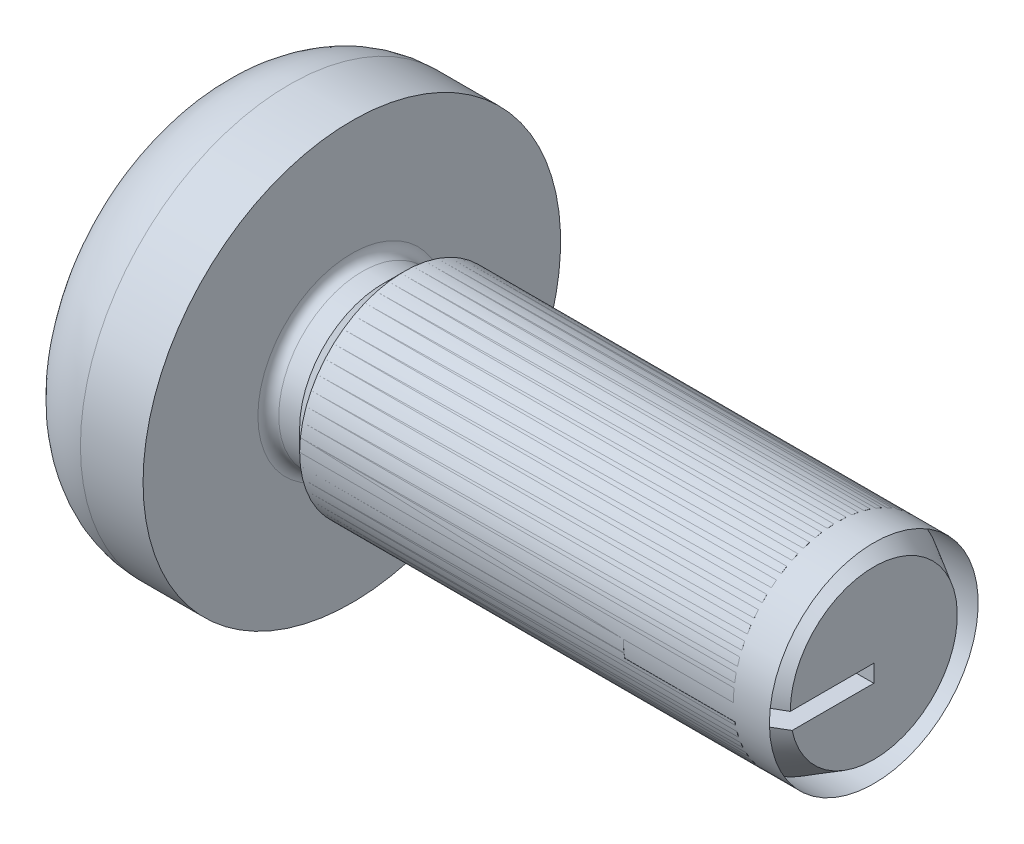
ISO-10303-21;
HEADER;
FILE_DESCRIPTION(('STEP AP214'),'2;1');
FILE_NAME('part.step','',(''),(''),'','','');
FILE_SCHEMA(('AUTOMOTIVE_DESIGN { 1 0 10303 214 1 1 1 1 }'));
ENDSEC;
DATA;
#1=APPLICATION_CONTEXT('core data for automotive mechanical design processes');
#2=APPLICATION_PROTOCOL_DEFINITION('international standard','automotive_design',2000,#1);
#3=PRODUCT_CONTEXT('',#1,'mechanical');
#4=PRODUCT('Part','Part','',(#3));
#5=PRODUCT_RELATED_PRODUCT_CATEGORY('part','',(#4));
#6=PRODUCT_DEFINITION_FORMATION('','',#4);
#7=PRODUCT_DEFINITION_CONTEXT('part definition',#1,'design');
#8=PRODUCT_DEFINITION('design','',#6,#7);
#9=PRODUCT_DEFINITION_SHAPE('','',#8);
#10=(LENGTH_UNIT() NAMED_UNIT(*) SI_UNIT(.MILLI.,.METRE.));
#11=(NAMED_UNIT(*) PLANE_ANGLE_UNIT() SI_UNIT($,.RADIAN.));
#12=(NAMED_UNIT(*) SI_UNIT($,.STERADIAN.) SOLID_ANGLE_UNIT());
#13=UNCERTAINTY_MEASURE_WITH_UNIT(LENGTH_MEASURE(1.E-05),#10,'distance_accuracy_value','');
#14=(GEOMETRIC_REPRESENTATION_CONTEXT(3) GLOBAL_UNCERTAINTY_ASSIGNED_CONTEXT((#13)) GLOBAL_UNIT_ASSIGNED_CONTEXT((#10,
#11,#12)) REPRESENTATION_CONTEXT('',''));
#15=CARTESIAN_POINT('',(0.,0.,0.));
#16=DIRECTION('',(0.,0.,1.));
#17=DIRECTION('',(1.,0.,0.));
#18=AXIS2_PLACEMENT_3D('',#15,#16,#17);
#19=CARTESIAN_POINT('',(0.380263667810502,0.,0.));
#20=DIRECTION('',(-1.,0.,0.));
#21=DIRECTION('',(0.,0.,1.));
#22=AXIS2_PLACEMENT_3D('',#19,#20,#21);
#23=CYLINDRICAL_SURFACE('',#22,0.625);
#24=CARTESIAN_POINT('',(1.5677636678105,0.,0.));
#25=DIRECTION('',(-1.,0.,0.));
#26=DIRECTION('',(0.,0.,1.));
#27=AXIS2_PLACEMENT_3D('',#24,#25,#26);
#28=CIRCLE('',#27,0.625);
#29=CARTESIAN_POINT('',(1.5677636678105,0.,0.625));
#30=VERTEX_POINT('',#29);
#31=EDGE_CURVE('E208',#30,#30,#28,.T.);
#32=ORIENTED_EDGE('',*,*,#31,.F.);
#33=EDGE_LOOP('',(#32));
#34=FACE_BOUND('',#33,.T.);
#35=DIRECTION('',(-1.,0.,0.));
#36=VECTOR('',#35,1.);
#37=CARTESIAN_POINT('',(0.380263667810502,0.,0.625));
#38=LINE('',#37,#36);
#39=CARTESIAN_POINT('',(4.16375731686439,0.,0.625));
#40=VERTEX_POINT('',#39);
#41=CARTESIAN_POINT('',(3.5052636678105,0.,0.625));
#42=VERTEX_POINT('',#41);
#43=EDGE_CURVE('E350',#40,#42,#38,.T.);
#44=ORIENTED_EDGE('',*,*,#43,.F.);
#45=CARTESIAN_POINT('',(4.16375731686439,0.,0.));
#46=DIRECTION('',(-1.,0.,0.));
#47=DIRECTION('',(0.,0.,1.));
#48=AXIS2_PLACEMENT_3D('',#45,#46,#47);
#49=CIRCLE('',#48,0.625);
#50=CARTESIAN_POINT('',(4.16375731686439,-0.104166666666667,0.616258310739543));
#51=VERTEX_POINT('',#50);
#52=EDGE_CURVE('E347',#40,#51,#49,.T.);
#53=ORIENTED_EDGE('',*,*,#52,.T.);
#54=DIRECTION('',(-1.,0.,0.));
#55=VECTOR('',#54,1.);
#56=CARTESIAN_POINT('',(0.380263667810502,-0.104166666666667,0.616258310739544));
#57=LINE('',#56,#55);
#58=CARTESIAN_POINT('',(3.5052636678105,-0.104166666666667,0.616258310739544));
#59=VERTEX_POINT('',#58);
#60=EDGE_CURVE('E354',#59,#51,#57,.F.);
#61=ORIENTED_EDGE('',*,*,#60,.F.);
#62=CARTESIAN_POINT('',(3.5052636678105,0.,0.));
#63=DIRECTION('',(1.,0.,0.));
#64=DIRECTION('',(0.,0.,-1.));
#65=AXIS2_PLACEMENT_3D('',#62,#63,#64);
#66=CIRCLE('',#65,0.625);
#67=EDGE_CURVE('E12',#42,#59,#66,.T.);
#68=ORIENTED_EDGE('',*,*,#67,.F.);
#69=EDGE_LOOP('',(#44,#53,#61,#68));
#70=FACE_BOUND('',#69,.T.);
#71=ADVANCED_FACE('F44',(#34,#70),#23,.T.);
#72=CARTESIAN_POINT('',(4.16375731686439,0.,0.));
#73=DIRECTION('',(-1.,0.,0.));
#74=DIRECTION('',(0.,0.,1.));
#75=AXIS2_PLACEMENT_3D('',#72,#73,#74);
#76=CONICAL_SURFACE('',#75,0.625,0.523598775598293);
#77=ORIENTED_EDGE('',*,*,#52,.F.);
#78=DIRECTION('',(-0.866025403784441,0.,0.499999999999995));
#79=VECTOR('',#78,1.);
#80=CARTESIAN_POINT('',(5.24628907159495,0.,0.));
#81=LINE('',#80,#79);
#82=CARTESIAN_POINT('',(4.3802636678105,0.,0.5));
#83=VERTEX_POINT('',#82);
#84=EDGE_CURVE('E352',#40,#83,#81,.F.);
#85=ORIENTED_EDGE('',*,*,#84,.T.);
#86=CARTESIAN_POINT('',(4.3802636678105,0.,0.));
#87=DIRECTION('',(-1.,0.,0.));
#88=DIRECTION('',(0.,0.,1.));
#89=AXIS2_PLACEMENT_3D('',#86,#87,#88);
#90=CIRCLE('',#89,0.5);
#91=CARTESIAN_POINT('',(4.3802636678105,-0.104166666666667,0.489028941429396));
#92=VERTEX_POINT('',#91);
#93=EDGE_CURVE('E206',#83,#92,#90,.T.);
#94=ORIENTED_EDGE('',*,*,#93,.T.);
#95=CARTESIAN_POINT('',(4.9132359449589,-0.104166666666667,0.161629516517161));
#96=CARTESIAN_POINT('',(4.8955934769391,-0.104166666666667,0.173717735895785));
#97=CARTESIAN_POINT('',(4.87779788339217,-0.104166666666667,0.185576255125332));
#98=CARTESIAN_POINT('',(4.84199518748673,-0.104166666666667,0.208965011190701));
#99=CARTESIAN_POINT('',(4.82398811474114,-0.104166666666667,0.220495293232509));
#100=CARTESIAN_POINT('',(4.78785616303248,-0.104166666666667,0.24335950070111));
#101=CARTESIAN_POINT('',(4.76973131030053,-0.104166666666667,0.254693467918929));
#102=CARTESIAN_POINT('',(4.7333949664228,-0.104166666666667,0.277223400047055));
#103=CARTESIAN_POINT('',(4.71518347165011,-0.104166666666667,0.288419359108538));
#104=CARTESIAN_POINT('',(4.62703840514019,-0.104166666666667,0.342310237974458));
#105=CARTESIAN_POINT('',(4.55673005215801,-0.104166666666667,0.384390129499706));
#106=CARTESIAN_POINT('',(4.41583241356038,-0.104166666666667,0.46810411531456));
#107=CARTESIAN_POINT('',(4.34524307391098,-0.104166666666667,0.509738117553018));
#108=CARTESIAN_POINT('',(4.16707897189953,-0.104166666666667,0.614430801207478));
#109=CARTESIAN_POINT('',(4.05941539750572,-0.104166666666667,0.677338705090462));
#110=CARTESIAN_POINT('',(3.89785023528845,-0.104166666666667,0.771531672563001));
#111=CARTESIAN_POINT('',(3.8439940442539,-0.104166666666667,0.802895088044861));
#112=CARTESIAN_POINT('',(3.73625786465345,-0.104166666666667,0.865580839421581));
#113=CARTESIAN_POINT('',(3.68237787612275,-0.104166666666667,0.896903175376936));
#114=CARTESIAN_POINT('',(3.6284891272247,-0.104166666666667,0.928210568185007));
#115=B_SPLINE_CURVE_WITH_KNOTS('',3,(#95,#96,#97,#98,#99,#100,#101,#102,#103,#104,#105,#106,
#107,#108,#109,#110,#111,#112,#113,#114),.UNSPECIFIED.,.F.,.F.,(4,2,2,2,2,2,2,2,2,4),(0.,
0.0641527212972383,0.128296564085274,0.192426579972942,0.256559304428454,0.502368107267188,
0.748226713829344,1.12231031468587,1.3092792966044,1.49624800287637),.UNSPECIFIED.);
#116=EDGE_CURVE('E356',#92,#51,#115,.T.);
#117=ORIENTED_EDGE('',*,*,#116,.T.);
#118=EDGE_LOOP('',(#77,#85,#94,#117));
#119=FACE_BOUND('',#118,.T.);
#120=ADVANCED_FACE('F365',(#119),#76,.T.);
#121=CARTESIAN_POINT('',(4.3802636678105,0.625,0.));
#122=DIRECTION('',(-1.,0.,0.));
#123=DIRECTION('',(0.,0.,1.));
#124=AXIS2_PLACEMENT_3D('',#121,#122,#123);
#125=PLANE('',#124);
#126=DIRECTION('',(0.,0.,1.));
#127=VECTOR('',#126,1.);
#128=CARTESIAN_POINT('',(4.3802636678105,0.,0.));
#129=LINE('',#128,#127);
#130=CARTESIAN_POINT('',(4.3802636678105,0.,0.));
#131=VERTEX_POINT('',#130);
#132=EDGE_CURVE('E52',#131,#83,#129,.T.);
#133=ORIENTED_EDGE('',*,*,#132,.F.);
#134=DIRECTION('',(0.,1.,0.));
#135=VECTOR('',#134,1.);
#136=CARTESIAN_POINT('',(4.3802636678105,0.,0.));
#137=LINE('',#136,#135);
#138=CARTESIAN_POINT('',(4.3802636678105,-0.104166666666667,0.));
#139=VERTEX_POINT('',#138);
#140=EDGE_CURVE('E196',#139,#131,#137,.T.);
#141=ORIENTED_EDGE('',*,*,#140,.F.);
#142=DIRECTION('',(0.,0.,-1.));
#143=VECTOR('',#142,1.);
#144=CARTESIAN_POINT('',(4.3802636678105,-0.104166666666667,0.));
#145=LINE('',#144,#143);
#146=EDGE_CURVE('E207',#92,#139,#145,.T.);
#147=ORIENTED_EDGE('',*,*,#146,.F.);
#148=ORIENTED_EDGE('',*,*,#93,.F.);
#149=EDGE_LOOP('',(#133,#141,#147,#148));
#150=FACE_BOUND('',#149,.T.);
#151=ADVANCED_FACE('F204',(#150),#125,.F.);
#152=CARTESIAN_POINT('',(0.380263667810502,0.,0.));
#153=DIRECTION('',(1.,0.,0.));
#154=DIRECTION('',(0.,0.,-1.));
#155=AXIS2_PLACEMENT_3D('',#152,#153,#154);
#156=PLANE('',#155);
#157=CARTESIAN_POINT('',(0.380263667810502,0.,0.));
#158=DIRECTION('',(-1.,0.,0.));
#159=DIRECTION('',(0.,0.,1.));
#160=AXIS2_PLACEMENT_3D('',#157,#158,#159);
#161=CIRCLE('',#160,0.75);
#162=CARTESIAN_POINT('',(0.380263667810502,0.,0.75));
#163=VERTEX_POINT('',#162);
#164=EDGE_CURVE('E234',#163,#163,#161,.T.);
#165=ORIENTED_EDGE('',*,*,#164,.T.);
#166=EDGE_LOOP('',(#165));
#167=FACE_BOUND('',#166,.T.);
#168=DIRECTION('',(0.,0.,-1.));
#169=VECTOR('',#168,1.);
#170=CARTESIAN_POINT('',(0.380263667810502,-0.140625,0.140625));
#171=LINE('',#170,#169);
#172=CARTESIAN_POINT('',(0.380263667810502,-0.140625,0.6859375));
#173=VERTEX_POINT('',#172);
#174=CARTESIAN_POINT('',(0.380263667810502,-0.140625,0.2778125));
#175=VERTEX_POINT('',#174);
#176=EDGE_CURVE('E283',#173,#175,#171,.T.);
#177=ORIENTED_EDGE('',*,*,#176,.T.);
#178=DIRECTION('',(0.,0.707106781186548,0.707106781186547));
#179=VECTOR('',#178,1.);
#180=CARTESIAN_POINT('',(0.380263667810502,-0.2778125,0.140625));
#181=LINE('',#180,#179);
#182=CARTESIAN_POINT('',(0.380263667810502,-0.2778125,0.140625));
#183=VERTEX_POINT('',#182);
#184=EDGE_CURVE('E342',#183,#175,#181,.T.);
#185=ORIENTED_EDGE('',*,*,#184,.F.);
#186=DIRECTION('',(0.,-1.,0.));
#187=VECTOR('',#186,1.);
#188=CARTESIAN_POINT('',(0.380263667810502,-0.140625,0.140625));
#189=LINE('',#188,#187);
#190=CARTESIAN_POINT('',(0.380263667810502,-0.6859375,0.140625));
#191=VERTEX_POINT('',#190);
#192=EDGE_CURVE('E281',#183,#191,#189,.T.);
#193=ORIENTED_EDGE('',*,*,#192,.T.);
#194=DIRECTION('',(0.,0.,-1.));
#195=VECTOR('',#194,1.);
#196=CARTESIAN_POINT('',(0.380263667810502,-0.6859375,-0.140625));
#197=LINE('',#196,#195);
#198=CARTESIAN_POINT('',(0.380263667810502,-0.6859375,-0.140625));
#199=VERTEX_POINT('',#198);
#200=EDGE_CURVE('E278',#191,#199,#197,.T.);
#201=ORIENTED_EDGE('',*,*,#200,.T.);
#202=DIRECTION('',(0.,1.,0.));
#203=VECTOR('',#202,1.);
#204=CARTESIAN_POINT('',(0.380263667810502,-0.140625,-0.140625));
#205=LINE('',#204,#203);
#206=CARTESIAN_POINT('',(0.380263667810502,-0.2778125,-0.140625));
#207=VERTEX_POINT('',#206);
#208=EDGE_CURVE('E275',#199,#207,#205,.T.);
#209=ORIENTED_EDGE('',*,*,#208,.T.);
#210=DIRECTION('',(0.,-0.707106781186548,0.707106781186547));
#211=VECTOR('',#210,1.);
#212=CARTESIAN_POINT('',(0.380263667810502,-0.2778125,-0.140625));
#213=LINE('',#212,#211);
#214=CARTESIAN_POINT('',(0.380263667810502,-0.140625,-0.2778125));
#215=VERTEX_POINT('',#214);
#216=EDGE_CURVE('E333',#215,#207,#213,.T.);
#217=ORIENTED_EDGE('',*,*,#216,.F.);
#218=DIRECTION('',(0.,0.,-1.));
#219=VECTOR('',#218,1.);
#220=CARTESIAN_POINT('',(0.380263667810502,-0.140625,-0.6859375));
#221=LINE('',#220,#219);
#222=CARTESIAN_POINT('',(0.380263667810502,-0.140625,-0.6859375));
#223=VERTEX_POINT('',#222);
#224=EDGE_CURVE('E273',#215,#223,#221,.T.);
#225=ORIENTED_EDGE('',*,*,#224,.T.);
#226=DIRECTION('',(0.,1.,0.));
#227=VECTOR('',#226,1.);
#228=CARTESIAN_POINT('',(0.380263667810502,0.140625,-0.6859375));
#229=LINE('',#228,#227);
#230=CARTESIAN_POINT('',(0.380263667810502,0.140625,-0.6859375));
#231=VERTEX_POINT('',#230);
#232=EDGE_CURVE('E270',#223,#231,#229,.T.);
#233=ORIENTED_EDGE('',*,*,#232,.T.);
#234=DIRECTION('',(0.,0.,1.));
#235=VECTOR('',#234,1.);
#236=CARTESIAN_POINT('',(0.380263667810502,0.140625,-0.6859375));
#237=LINE('',#236,#235);
#238=CARTESIAN_POINT('',(0.380263667810502,0.140625,-0.2778125));
#239=VERTEX_POINT('',#238);
#240=EDGE_CURVE('E267',#231,#239,#237,.T.);
#241=ORIENTED_EDGE('',*,*,#240,.T.);
#242=DIRECTION('',(0.,-0.707106781186548,-0.707106781186547));
#243=VECTOR('',#242,1.);
#244=CARTESIAN_POINT('',(0.380263667810502,0.2778125,-0.140625));
#245=LINE('',#244,#243);
#246=CARTESIAN_POINT('',(0.380263667810502,0.2778125,-0.140625));
#247=VERTEX_POINT('',#246);
#248=EDGE_CURVE('E325',#247,#239,#245,.T.);
#249=ORIENTED_EDGE('',*,*,#248,.F.);
#250=DIRECTION('',(0.,1.,0.));
#251=VECTOR('',#250,1.);
#252=CARTESIAN_POINT('',(0.380263667810502,0.6859375,-0.140625));
#253=LINE('',#252,#251);
#254=CARTESIAN_POINT('',(0.380263667810502,0.6859375,-0.140625));
#255=VERTEX_POINT('',#254);
#256=EDGE_CURVE('E297',#247,#255,#253,.T.);
#257=ORIENTED_EDGE('',*,*,#256,.T.);
#258=DIRECTION('',(0.,0.,1.));
#259=VECTOR('',#258,1.);
#260=CARTESIAN_POINT('',(0.380263667810502,0.6859375,-0.140625));
#261=LINE('',#260,#259);
#262=CARTESIAN_POINT('',(0.380263667810502,0.6859375,0.140625));
#263=VERTEX_POINT('',#262);
#264=EDGE_CURVE('E294',#255,#263,#261,.T.);
#265=ORIENTED_EDGE('',*,*,#264,.T.);
#266=DIRECTION('',(0.,-1.,0.));
#267=VECTOR('',#266,1.);
#268=CARTESIAN_POINT('',(0.380263667810502,0.6859375,0.140625));
#269=LINE('',#268,#267);
#270=CARTESIAN_POINT('',(0.380263667810502,0.2778125,0.140625));
#271=VERTEX_POINT('',#270);
#272=EDGE_CURVE('E291',#263,#271,#269,.T.);
#273=ORIENTED_EDGE('',*,*,#272,.T.);
#274=DIRECTION('',(0.,0.707106781186548,-0.707106781186547));
#275=VECTOR('',#274,1.);
#276=CARTESIAN_POINT('',(0.380263667810502,0.2778125,0.140625));
#277=LINE('',#276,#275);
#278=CARTESIAN_POINT('',(0.380263667810502,0.140625,0.2778125));
#279=VERTEX_POINT('',#278);
#280=EDGE_CURVE('E315',#279,#271,#277,.T.);
#281=ORIENTED_EDGE('',*,*,#280,.F.);
#282=DIRECTION('',(0.,0.,1.));
#283=VECTOR('',#282,1.);
#284=CARTESIAN_POINT('',(0.380263667810502,0.140625,0.140625));
#285=LINE('',#284,#283);
#286=CARTESIAN_POINT('',(0.380263667810502,0.140625,0.6859375));
#287=VERTEX_POINT('',#286);
#288=EDGE_CURVE('E289',#279,#287,#285,.T.);
#289=ORIENTED_EDGE('',*,*,#288,.T.);
#290=DIRECTION('',(0.,-1.,0.));
#291=VECTOR('',#290,1.);
#292=CARTESIAN_POINT('',(0.380263667810502,0.140625,0.6859375));
#293=LINE('',#292,#291);
#294=EDGE_CURVE('E286',#287,#173,#293,.T.);
#295=ORIENTED_EDGE('',*,*,#294,.T.);
#296=EDGE_LOOP('',(#177,#185,#193,#201,#209,#217,#225,#233,#241,#249,#257,#265,#273,#281,#289,#295));
#297=FACE_BOUND('',#296,.T.);
#298=ADVANCED_FACE('F397',(#167,#297),#156,.F.);
#299=CARTESIAN_POINT('',(1.5677636678105,0.,0.));
#300=DIRECTION('',(1.,0.,0.));
#301=DIRECTION('',(0.,0.,-1.));
#302=AXIS2_PLACEMENT_3D('',#299,#300,#301);
#303=CONICAL_SURFACE('',#302,0.625,0.78539816339745);
#304=CARTESIAN_POINT('',(1.4427636678105,0.,0.));
#305=DIRECTION('',(-1.,0.,0.));
#306=DIRECTION('',(0.,0.,1.));
#307=AXIS2_PLACEMENT_3D('',#304,#305,#306);
#308=CIRCLE('',#307,0.5);
#309=CARTESIAN_POINT('',(1.4427636678105,0.,0.5));
#310=VERTEX_POINT('',#309);
#311=EDGE_CURVE('E250',#310,#310,#308,.T.);
#312=ORIENTED_EDGE('',*,*,#311,.F.);
#313=EDGE_LOOP('',(#312));
#314=FACE_BOUND('',#313,.T.);
#315=ORIENTED_EDGE('',*,*,#31,.T.);
#316=EDGE_LOOP('',(#315));
#317=FACE_BOUND('',#316,.T.);
#318=ADVANCED_FACE('F393',(#314,#317),#303,.T.);
#319=CARTESIAN_POINT('',(0.380263667810502,0.,0.));
#320=DIRECTION('',(-1.,0.,0.));
#321=DIRECTION('',(0.,0.,1.));
#322=AXIS2_PLACEMENT_3D('',#319,#320,#321);
#323=CYLINDRICAL_SURFACE('',#322,0.5);
#324=CARTESIAN_POINT('',(1.3177636678105,0.,0.));
#325=DIRECTION('',(-1.,0.,0.));
#326=DIRECTION('',(0.,0.,1.));
#327=AXIS2_PLACEMENT_3D('',#324,#325,#326);
#328=CIRCLE('',#327,0.5);
#329=CARTESIAN_POINT('',(1.3177636678105,0.,0.5));
#330=VERTEX_POINT('',#329);
#331=EDGE_CURVE('E253',#330,#330,#328,.T.);
#332=ORIENTED_EDGE('',*,*,#331,.F.);
#333=EDGE_LOOP('',(#332));
#334=FACE_BOUND('',#333,.T.);
#335=ORIENTED_EDGE('',*,*,#311,.T.);
#336=EDGE_LOOP('',(#335));
#337=FACE_BOUND('',#336,.T.);
#338=ADVANCED_FACE('F520',(#334,#337),#323,.T.);
#339=CARTESIAN_POINT('',(1.3177636678105,0.,0.));
#340=DIRECTION('',(-1.,0.,0.));
#341=DIRECTION('',(0.,0.,1.));
#342=AXIS2_PLACEMENT_3D('',#339,#340,#341);
#343=TOROIDAL_SURFACE('',#342,0.5625,0.0625000000000001);
#344=CARTESIAN_POINT('',(1.2552636678105,0.,0.));
#345=DIRECTION('',(-1.,0.,0.));
#346=DIRECTION('',(0.,0.,1.));
#347=AXIS2_PLACEMENT_3D('',#344,#345,#346);
#348=CIRCLE('',#347,0.5625);
#349=CARTESIAN_POINT('',(1.2552636678105,0.,0.5625));
#350=VERTEX_POINT('',#349);
#351=EDGE_CURVE('E256',#350,#350,#348,.T.);
#352=ORIENTED_EDGE('',*,*,#351,.F.);
#353=EDGE_LOOP('',(#352));
#354=FACE_BOUND('',#353,.T.);
#355=ORIENTED_EDGE('',*,*,#331,.T.);
#356=EDGE_LOOP('',(#355));
#357=FACE_BOUND('',#356,.T.);
#358=ADVANCED_FACE('F517',(#354,#357),#343,.F.);
#359=CARTESIAN_POINT('',(1.2552636678105,1.25,0.));
#360=DIRECTION('',(-1.,0.,0.));
#361=DIRECTION('',(0.,0.,1.));
#362=AXIS2_PLACEMENT_3D('',#359,#360,#361);
#363=PLANE('',#362);
#364=CARTESIAN_POINT('',(1.2552636678105,0.,0.));
#365=DIRECTION('',(-1.,0.,0.));
#366=DIRECTION('',(0.,0.,1.));
#367=AXIS2_PLACEMENT_3D('',#364,#365,#366);
#368=CIRCLE('',#367,1.25);
#369=CARTESIAN_POINT('',(1.2552636678105,0.,1.25));
#370=VERTEX_POINT('',#369);
#371=EDGE_CURVE('E259',#370,#370,#368,.T.);
#372=ORIENTED_EDGE('',*,*,#371,.F.);
#373=EDGE_LOOP('',(#372));
#374=FACE_BOUND('',#373,.T.);
#375=ORIENTED_EDGE('',*,*,#351,.T.);
#376=EDGE_LOOP('',(#375));
#377=FACE_BOUND('',#376,.T.);
#378=ADVANCED_FACE('F513',(#374,#377),#363,.F.);
#379=CARTESIAN_POINT('',(0.380263667810502,0.,0.));
#380=DIRECTION('',(-1.,0.,0.));
#381=DIRECTION('',(0.,0.,1.));
#382=AXIS2_PLACEMENT_3D('',#379,#380,#381);
#383=CYLINDRICAL_SURFACE('',#382,1.25);
#384=CARTESIAN_POINT('',(0.880263667810502,0.,0.));
#385=DIRECTION('',(-1.,0.,0.));
#386=DIRECTION('',(0.,0.,1.));
#387=AXIS2_PLACEMENT_3D('',#384,#385,#386);
#388=CIRCLE('',#387,1.25);
#389=CARTESIAN_POINT('',(0.880263667810502,0.,1.25));
#390=VERTEX_POINT('',#389);
#391=EDGE_CURVE('E262',#390,#390,#388,.T.);
#392=ORIENTED_EDGE('',*,*,#391,.F.);
#393=EDGE_LOOP('',(#392));
#394=FACE_BOUND('',#393,.T.);
#395=ORIENTED_EDGE('',*,*,#371,.T.);
#396=EDGE_LOOP('',(#395));
#397=FACE_BOUND('',#396,.T.);
#398=ADVANCED_FACE('F509',(#394,#397),#383,.T.);
#399=CARTESIAN_POINT('',(0.880263667810502,0.,0.));
#400=DIRECTION('',(-1.,0.,0.));
#401=DIRECTION('',(0.,0.,1.));
#402=AXIS2_PLACEMENT_3D('',#399,#400,#401);
#403=TOROIDAL_SURFACE('',#402,0.75,0.5);
#404=ORIENTED_EDGE('',*,*,#164,.F.);
#405=EDGE_LOOP('',(#404));
#406=FACE_BOUND('',#405,.T.);
#407=ORIENTED_EDGE('',*,*,#391,.T.);
#408=EDGE_LOOP('',(#407));
#409=FACE_BOUND('',#408,.T.);
#410=ADVANCED_FACE('F503',(#406,#409),#403,.T.);
#411=CARTESIAN_POINT('',(1.0052636678105,0.6859375,-0.140625));
#412=DIRECTION('',(0.,0.,1.));
#413=DIRECTION('',(1.,0.,0.));
#414=AXIS2_PLACEMENT_3D('',#411,#412,#413);
#415=PLANE('',#414);
#416=DIRECTION('',(-1.,0.,0.));
#417=VECTOR('',#416,1.);
#418=CARTESIAN_POINT('',(1.19927609089856,0.2778125,-0.140625));
#419=LINE('',#418,#417);
#420=CARTESIAN_POINT('',(1.0052636678105,0.2778125,-0.140625));
#421=VERTEX_POINT('',#420);
#422=EDGE_CURVE('E323',#421,#247,#419,.T.);
#423=ORIENTED_EDGE('',*,*,#422,.F.);
#424=DIRECTION('',(0.,1.,0.));
#425=VECTOR('',#424,1.);
#426=CARTESIAN_POINT('',(1.0052636678105,0.6859375,-0.140625));
#427=LINE('',#426,#425);
#428=CARTESIAN_POINT('',(1.0052636678105,0.458456103583623,-0.140625));
#429=VERTEX_POINT('',#428);
#430=EDGE_CURVE('E238',#421,#429,#427,.T.);
#431=ORIENTED_EDGE('',*,*,#430,.T.);
#432=DIRECTION('',(-0.939692620785908,0.342020143325669,0.));
#433=VECTOR('',#432,1.);
#434=CARTESIAN_POINT('',(0.380263667810502,0.6859375,-0.140625));
#435=LINE('',#434,#433);
#436=EDGE_CURVE('E231',#429,#255,#435,.T.);
#437=ORIENTED_EDGE('',*,*,#436,.T.);
#438=ORIENTED_EDGE('',*,*,#256,.F.);
#439=EDGE_LOOP('',(#423,#431,#437,#438));
#440=FACE_BOUND('',#439,.T.);
#441=ADVANCED_FACE('F470',(#440),#415,.T.);
#442=CARTESIAN_POINT('',(0.380263667810502,0.6859375,-0.140625));
#443=DIRECTION('',(-0.342020143325669,-0.939692620785908,0.));
#444=DIRECTION('',(0.939692620785908,-0.342020143325669,0.));
#445=AXIS2_PLACEMENT_3D('',#442,#443,#444);
#446=PLANE('',#445);
#447=ORIENTED_EDGE('',*,*,#264,.F.);
#448=ORIENTED_EDGE('',*,*,#436,.F.);
#449=DIRECTION('',(0.,0.,1.));
#450=VECTOR('',#449,1.);
#451=CARTESIAN_POINT('',(1.0052636678105,0.458456103583623,-0.140625));
#452=LINE('',#451,#450);
#453=CARTESIAN_POINT('',(1.0052636678105,0.458456103583623,0.140625));
#454=VERTEX_POINT('',#453);
#455=EDGE_CURVE('E235',#429,#454,#452,.T.);
#456=ORIENTED_EDGE('',*,*,#455,.T.);
#457=DIRECTION('',(-0.939692620785908,0.342020143325669,0.));
#458=VECTOR('',#457,1.);
#459=CARTESIAN_POINT('',(0.932152556285182,0.485066371972956,0.140625));
#460=LINE('',#459,#458);
#461=EDGE_CURVE('E225',#454,#263,#460,.T.);
#462=ORIENTED_EDGE('',*,*,#461,.T.);
#463=EDGE_LOOP('',(#447,#448,#456,#462));
#464=FACE_BOUND('',#463,.T.);
#465=ADVANCED_FACE('F46',(#464),#446,.T.);
#466=CARTESIAN_POINT('',(1.0052636678105,0.6859375,0.140625));
#467=DIRECTION('',(0.,0.,-1.));
#468=DIRECTION('',(0.,1.,0.));
#469=AXIS2_PLACEMENT_3D('',#466,#467,#468);
#470=PLANE('',#469);
#471=DIRECTION('',(-1.,0.,0.));
#472=VECTOR('',#471,1.);
#473=CARTESIAN_POINT('',(1.19927609089856,0.2778125,0.140625));
#474=LINE('',#473,#472);
#475=CARTESIAN_POINT('',(1.0052636678105,0.2778125,0.140625));
#476=VERTEX_POINT('',#475);
#477=EDGE_CURVE('E314',#476,#271,#474,.T.);
#478=ORIENTED_EDGE('',*,*,#477,.T.);
#479=ORIENTED_EDGE('',*,*,#272,.F.);
#480=ORIENTED_EDGE('',*,*,#461,.F.);
#481=DIRECTION('',(0.,-1.,0.));
#482=VECTOR('',#481,1.);
#483=CARTESIAN_POINT('',(1.0052636678105,0.6859375,0.140625));
#484=LINE('',#483,#482);
#485=EDGE_CURVE('E237',#454,#476,#484,.T.);
#486=ORIENTED_EDGE('',*,*,#485,.T.);
#487=EDGE_LOOP('',(#478,#479,#480,#486));
#488=FACE_BOUND('',#487,.T.);
#489=ADVANCED_FACE('F420',(#488),#470,.T.);
#490=CARTESIAN_POINT('',(1.0052636678105,0.140625,0.140625));
#491=DIRECTION('',(0.,-1.,0.));
#492=DIRECTION('',(0.,0.,-1.));
#493=AXIS2_PLACEMENT_3D('',#490,#491,#492);
#494=PLANE('',#493);
#495=DIRECTION('',(-1.,0.,0.));
#496=VECTOR('',#495,1.);
#497=CARTESIAN_POINT('',(1.19927609089856,0.140625,0.2778125));
#498=LINE('',#497,#496);
#499=CARTESIAN_POINT('',(1.0052636678105,0.140625,0.2778125));
#500=VERTEX_POINT('',#499);
#501=EDGE_CURVE('E312',#500,#279,#498,.T.);
#502=ORIENTED_EDGE('',*,*,#501,.F.);
#503=DIRECTION('',(0.,0.,1.));
#504=VECTOR('',#503,1.);
#505=CARTESIAN_POINT('',(1.0052636678105,0.140625,0.140625));
#506=LINE('',#505,#504);
#507=CARTESIAN_POINT('',(1.0052636678105,0.140625,0.458456103583623));
#508=VERTEX_POINT('',#507);
#509=EDGE_CURVE('E229',#500,#508,#506,.T.);
#510=ORIENTED_EDGE('',*,*,#509,.T.);
#511=DIRECTION('',(-0.939692620785908,0.,0.342020143325669));
#512=VECTOR('',#511,1.);
#513=CARTESIAN_POINT('',(0.380263667810502,0.140625,0.6859375));
#514=LINE('',#513,#512);
#515=EDGE_CURVE('E222',#508,#287,#514,.T.);
#516=ORIENTED_EDGE('',*,*,#515,.T.);
#517=ORIENTED_EDGE('',*,*,#288,.F.);
#518=EDGE_LOOP('',(#502,#510,#516,#517));
#519=FACE_BOUND('',#518,.T.);
#520=ADVANCED_FACE('F412',(#519),#494,.T.);
#521=CARTESIAN_POINT('',(0.380263667810502,0.140625,0.6859375));
#522=DIRECTION('',(-0.342020143325669,0.,-0.939692620785908));
#523=DIRECTION('',(-0.939692620785908,0.,0.342020143325669));
#524=AXIS2_PLACEMENT_3D('',#521,#522,#523);
#525=PLANE('',#524);
#526=ORIENTED_EDGE('',*,*,#294,.F.);
#527=ORIENTED_EDGE('',*,*,#515,.F.);
#528=DIRECTION('',(0.,-1.,0.));
#529=VECTOR('',#528,1.);
#530=CARTESIAN_POINT('',(1.0052636678105,0.140625,0.458456103583623));
#531=LINE('',#530,#529);
#532=CARTESIAN_POINT('',(1.0052636678105,-0.140625,0.458456103583623));
#533=VERTEX_POINT('',#532);
#534=EDGE_CURVE('E226',#508,#533,#531,.T.);
#535=ORIENTED_EDGE('',*,*,#534,.T.);
#536=DIRECTION('',(-0.939692620785908,0.,0.342020143325669));
#537=VECTOR('',#536,1.);
#538=CARTESIAN_POINT('',(1.10741261548878,-0.140625,0.421276927167115));
#539=LINE('',#538,#537);
#540=EDGE_CURVE('E214',#533,#173,#539,.T.);
#541=ORIENTED_EDGE('',*,*,#540,.T.);
#542=EDGE_LOOP('',(#526,#527,#535,#541));
#543=FACE_BOUND('',#542,.T.);
#544=ADVANCED_FACE('F409',(#543),#525,.T.);
#545=CARTESIAN_POINT('',(1.0052636678105,-0.140625,0.140625));
#546=DIRECTION('',(0.,1.,0.));
#547=DIRECTION('',(0.,0.,1.));
#548=AXIS2_PLACEMENT_3D('',#545,#546,#547);
#549=PLANE('',#548);
#550=DIRECTION('',(-1.,0.,0.));
#551=VECTOR('',#550,1.);
#552=CARTESIAN_POINT('',(1.19927609089856,-0.140625,0.2778125));
#553=LINE('',#552,#551);
#554=CARTESIAN_POINT('',(1.0052636678105,-0.140625,0.2778125));
#555=VERTEX_POINT('',#554);
#556=EDGE_CURVE('E339',#555,#175,#553,.T.);
#557=ORIENTED_EDGE('',*,*,#556,.T.);
#558=ORIENTED_EDGE('',*,*,#176,.F.);
#559=ORIENTED_EDGE('',*,*,#540,.F.);
#560=DIRECTION('',(0.,0.,-1.));
#561=VECTOR('',#560,1.);
#562=CARTESIAN_POINT('',(1.0052636678105,-0.140625,0.140625));
#563=LINE('',#562,#561);
#564=EDGE_CURVE('E228',#533,#555,#563,.T.);
#565=ORIENTED_EDGE('',*,*,#564,.T.);
#566=EDGE_LOOP('',(#557,#558,#559,#565));
#567=FACE_BOUND('',#566,.T.);
#568=ADVANCED_FACE('F411',(#567),#549,.T.);
#569=CARTESIAN_POINT('',(1.0052636678105,-0.140625,0.140625));
#570=DIRECTION('',(0.,0.,-1.));
#571=DIRECTION('',(0.,1.,0.));
#572=AXIS2_PLACEMENT_3D('',#569,#570,#571);
#573=PLANE('',#572);
#574=DIRECTION('',(-1.,0.,0.));
#575=VECTOR('',#574,1.);
#576=CARTESIAN_POINT('',(1.19927609089856,-0.2778125,0.140625));
#577=LINE('',#576,#575);
#578=CARTESIAN_POINT('',(1.0052636678105,-0.2778125,0.140625));
#579=VERTEX_POINT('',#578);
#580=EDGE_CURVE('E340',#579,#183,#577,.T.);
#581=ORIENTED_EDGE('',*,*,#580,.F.);
#582=DIRECTION('',(0.,-1.,0.));
#583=VECTOR('',#582,1.);
#584=CARTESIAN_POINT('',(1.0052636678105,-0.140625,0.140625));
#585=LINE('',#584,#583);
#586=CARTESIAN_POINT('',(1.0052636678105,-0.458456103583623,0.140625));
#587=VERTEX_POINT('',#586);
#588=EDGE_CURVE('E219',#579,#587,#585,.T.);
#589=ORIENTED_EDGE('',*,*,#588,.T.);
#590=DIRECTION('',(-0.939692620785908,-0.342020143325669,0.));
#591=VECTOR('',#590,1.);
#592=CARTESIAN_POINT('',(0.380263667810502,-0.6859375,0.140625));
#593=LINE('',#592,#591);
#594=EDGE_CURVE('E211',#587,#191,#593,.T.);
#595=ORIENTED_EDGE('',*,*,#594,.T.);
#596=ORIENTED_EDGE('',*,*,#192,.F.);
#597=EDGE_LOOP('',(#581,#589,#595,#596));
#598=FACE_BOUND('',#597,.T.);
#599=ADVANCED_FACE('F407',(#598),#573,.T.);
#600=CARTESIAN_POINT('',(0.380263667810502,-0.6859375,-0.140625));
#601=DIRECTION('',(-0.342020143325669,0.939692620785908,0.));
#602=DIRECTION('',(-0.939692620785908,-0.342020143325669,0.));
#603=AXIS2_PLACEMENT_3D('',#600,#601,#602);
#604=PLANE('',#603);
#605=ORIENTED_EDGE('',*,*,#200,.F.);
#606=ORIENTED_EDGE('',*,*,#594,.F.);
#607=DIRECTION('',(0.,0.,-1.));
#608=VECTOR('',#607,1.);
#609=CARTESIAN_POINT('',(1.0052636678105,-0.458456103583623,-0.140625));
#610=LINE('',#609,#608);
#611=CARTESIAN_POINT('',(1.0052636678105,-0.458456103583623,-0.140625));
#612=VERTEX_POINT('',#611);
#613=EDGE_CURVE('E216',#587,#612,#610,.T.);
#614=ORIENTED_EDGE('',*,*,#613,.T.);
#615=DIRECTION('',(-0.939692620785908,-0.342020143325669,0.));
#616=VECTOR('',#615,1.);
#617=CARTESIAN_POINT('',(1.10741261548878,-0.421276927167115,-0.140625));
#618=LINE('',#617,#616);
#619=EDGE_CURVE('E215',#612,#199,#618,.T.);
#620=ORIENTED_EDGE('',*,*,#619,.T.);
#621=EDGE_LOOP('',(#605,#606,#614,#620));
#622=FACE_BOUND('',#621,.T.);
#623=ADVANCED_FACE('F404',(#622),#604,.T.);
#624=CARTESIAN_POINT('',(1.0052636678105,-0.140625,-0.140625));
#625=DIRECTION('',(0.,0.,1.));
#626=DIRECTION('',(1.,0.,0.));
#627=AXIS2_PLACEMENT_3D('',#624,#625,#626);
#628=PLANE('',#627);
#629=DIRECTION('',(-1.,0.,0.));
#630=VECTOR('',#629,1.);
#631=CARTESIAN_POINT('',(1.19927609089856,-0.2778125,-0.140625));
#632=LINE('',#631,#630);
#633=CARTESIAN_POINT('',(1.0052636678105,-0.2778125,-0.140625));
#634=VERTEX_POINT('',#633);
#635=EDGE_CURVE('E332',#634,#207,#632,.T.);
#636=ORIENTED_EDGE('',*,*,#635,.T.);
#637=ORIENTED_EDGE('',*,*,#208,.F.);
#638=ORIENTED_EDGE('',*,*,#619,.F.);
#639=DIRECTION('',(0.,1.,0.));
#640=VECTOR('',#639,1.);
#641=CARTESIAN_POINT('',(1.0052636678105,-0.140625,-0.140625));
#642=LINE('',#641,#640);
#643=EDGE_CURVE('E218',#612,#634,#642,.T.);
#644=ORIENTED_EDGE('',*,*,#643,.T.);
#645=EDGE_LOOP('',(#636,#637,#638,#644));
#646=FACE_BOUND('',#645,.T.);
#647=ADVANCED_FACE('F406',(#646),#628,.T.);
#648=CARTESIAN_POINT('',(1.0052636678105,-0.140625,-0.6859375));
#649=DIRECTION('',(0.,1.,0.));
#650=DIRECTION('',(0.,0.,1.));
#651=AXIS2_PLACEMENT_3D('',#648,#649,#650);
#652=PLANE('',#651);
#653=DIRECTION('',(-1.,0.,0.));
#654=VECTOR('',#653,1.);
#655=CARTESIAN_POINT('',(1.19927609089856,-0.140625,-0.2778125));
#656=LINE('',#655,#654);
#657=CARTESIAN_POINT('',(1.0052636678105,-0.140625,-0.2778125));
#658=VERTEX_POINT('',#657);
#659=EDGE_CURVE('E330',#658,#215,#656,.T.);
#660=ORIENTED_EDGE('',*,*,#659,.F.);
#661=DIRECTION('',(0.,0.,-1.));
#662=VECTOR('',#661,1.);
#663=CARTESIAN_POINT('',(1.0052636678105,-0.140625,-0.6859375));
#664=LINE('',#663,#662);
#665=CARTESIAN_POINT('',(1.0052636678105,-0.140625,-0.458456103583623));
#666=VERTEX_POINT('',#665);
#667=EDGE_CURVE('E246',#658,#666,#664,.T.);
#668=ORIENTED_EDGE('',*,*,#667,.T.);
#669=DIRECTION('',(-0.939692620785908,0.,-0.342020143325669));
#670=VECTOR('',#669,1.);
#671=CARTESIAN_POINT('',(0.380263667810502,-0.140625,-0.6859375));
#672=LINE('',#671,#670);
#673=EDGE_CURVE('E221',#666,#223,#672,.T.);
#674=ORIENTED_EDGE('',*,*,#673,.T.);
#675=ORIENTED_EDGE('',*,*,#224,.F.);
#676=EDGE_LOOP('',(#660,#668,#674,#675));
#677=FACE_BOUND('',#676,.T.);
#678=ADVANCED_FACE('F402',(#677),#652,.T.);
#679=CARTESIAN_POINT('',(0.380263667810502,0.140625,-0.6859375));
#680=DIRECTION('',(-0.342020143325669,0.,0.939692620785908));
#681=DIRECTION('',(0.939692620785908,0.,0.342020143325669));
#682=AXIS2_PLACEMENT_3D('',#679,#680,#681);
#683=PLANE('',#682);
#684=ORIENTED_EDGE('',*,*,#232,.F.);
#685=ORIENTED_EDGE('',*,*,#673,.F.);
#686=DIRECTION('',(0.,1.,0.));
#687=VECTOR('',#686,1.);
#688=CARTESIAN_POINT('',(1.0052636678105,0.140625,-0.458456103583623));
#689=LINE('',#688,#687);
#690=CARTESIAN_POINT('',(1.0052636678105,0.140625,-0.458456103583623));
#691=VERTEX_POINT('',#690);
#692=EDGE_CURVE('E243',#666,#691,#689,.T.);
#693=ORIENTED_EDGE('',*,*,#692,.T.);
#694=DIRECTION('',(-0.939692620785908,0.,-0.342020143325669));
#695=VECTOR('',#694,1.);
#696=CARTESIAN_POINT('',(0.932152556285182,0.140625,-0.485066371972956));
#697=LINE('',#696,#695);
#698=EDGE_CURVE('E242',#691,#231,#697,.T.);
#699=ORIENTED_EDGE('',*,*,#698,.T.);
#700=EDGE_LOOP('',(#684,#685,#693,#699));
#701=FACE_BOUND('',#700,.T.);
#702=ADVANCED_FACE('F398',(#701),#683,.T.);
#703=CARTESIAN_POINT('',(1.0052636678105,0.140625,-0.6859375));
#704=DIRECTION('',(0.,-1.,0.));
#705=DIRECTION('',(0.,0.,-1.));
#706=AXIS2_PLACEMENT_3D('',#703,#704,#705);
#707=PLANE('',#706);
#708=DIRECTION('',(-1.,0.,0.));
#709=VECTOR('',#708,1.);
#710=CARTESIAN_POINT('',(1.19927609089856,0.140625,-0.2778125));
#711=LINE('',#710,#709);
#712=CARTESIAN_POINT('',(1.0052636678105,0.140625,-0.2778125));
#713=VERTEX_POINT('',#712);
#714=EDGE_CURVE('E322',#713,#239,#711,.T.);
#715=ORIENTED_EDGE('',*,*,#714,.T.);
#716=ORIENTED_EDGE('',*,*,#240,.F.);
#717=ORIENTED_EDGE('',*,*,#698,.F.);
#718=DIRECTION('',(0.,0.,1.));
#719=VECTOR('',#718,1.);
#720=CARTESIAN_POINT('',(1.0052636678105,0.140625,-0.6859375));
#721=LINE('',#720,#719);
#722=EDGE_CURVE('E245',#691,#713,#721,.T.);
#723=ORIENTED_EDGE('',*,*,#722,.T.);
#724=EDGE_LOOP('',(#715,#716,#717,#723));
#725=FACE_BOUND('',#724,.T.);
#726=ADVANCED_FACE('F401',(#725),#707,.T.);
#727=CARTESIAN_POINT('',(1.0052636678105,0.140625,-0.140625));
#728=DIRECTION('',(-1.,0.,0.));
#729=DIRECTION('',(0.,0.,1.));
#730=AXIS2_PLACEMENT_3D('',#727,#728,#729);
#731=PLANE('',#730);
#732=ORIENTED_EDGE('',*,*,#588,.F.);
#733=DIRECTION('',(0.,-0.707106781186548,-0.707106781186547));
#734=VECTOR('',#733,1.);
#735=CARTESIAN_POINT('',(1.0052636678105,-0.2778125,0.140625));
#736=LINE('',#735,#734);
#737=EDGE_CURVE('E67',#555,#579,#736,.T.);
#738=ORIENTED_EDGE('',*,*,#737,.F.);
#739=ORIENTED_EDGE('',*,*,#564,.F.);
#740=ORIENTED_EDGE('',*,*,#534,.F.);
#741=ORIENTED_EDGE('',*,*,#509,.F.);
#742=DIRECTION('',(0.,-0.707106781186548,0.707106781186547));
#743=VECTOR('',#742,1.);
#744=CARTESIAN_POINT('',(1.0052636678105,0.2778125,0.140625));
#745=LINE('',#744,#743);
#746=EDGE_CURVE('E299',#476,#500,#745,.T.);
#747=ORIENTED_EDGE('',*,*,#746,.F.);
#748=ORIENTED_EDGE('',*,*,#485,.F.);
#749=ORIENTED_EDGE('',*,*,#455,.F.);
#750=ORIENTED_EDGE('',*,*,#430,.F.);
#751=DIRECTION('',(0.,0.707106781186548,0.707106781186547));
#752=VECTOR('',#751,1.);
#753=CARTESIAN_POINT('',(1.0052636678105,0.2778125,-0.140625));
#754=LINE('',#753,#752);
#755=EDGE_CURVE('E319',#713,#421,#754,.T.);
#756=ORIENTED_EDGE('',*,*,#755,.F.);
#757=ORIENTED_EDGE('',*,*,#722,.F.);
#758=ORIENTED_EDGE('',*,*,#692,.F.);
#759=ORIENTED_EDGE('',*,*,#667,.F.);
#760=DIRECTION('',(0.,0.707106781186548,-0.707106781186547));
#761=VECTOR('',#760,1.);
#762=CARTESIAN_POINT('',(1.0052636678105,-0.2778125,-0.140625));
#763=LINE('',#762,#761);
#764=EDGE_CURVE('E329',#634,#658,#763,.T.);
#765=ORIENTED_EDGE('',*,*,#764,.F.);
#766=ORIENTED_EDGE('',*,*,#643,.F.);
#767=ORIENTED_EDGE('',*,*,#613,.F.);
#768=EDGE_LOOP('',(#732,#738,#739,#740,#741,#747,#748,#749,#750,#756,#757,#758,#759,#765,#766,#767));
#769=FACE_BOUND('',#768,.T.);
#770=ADVANCED_FACE('F434',(#769),#731,.T.);
#771=CARTESIAN_POINT('',(1.19927609089856,0.2778125,0.140625));
#772=DIRECTION('',(0.,0.707106781186547,0.707106781186548));
#773=DIRECTION('',(0.,-0.707106781186548,0.707106781186547));
#774=AXIS2_PLACEMENT_3D('',#771,#772,#773);
#775=PLANE('',#774);
#776=ORIENTED_EDGE('',*,*,#746,.T.);
#777=ORIENTED_EDGE('',*,*,#501,.T.);
#778=ORIENTED_EDGE('',*,*,#280,.T.);
#779=ORIENTED_EDGE('',*,*,#477,.F.);
#780=EDGE_LOOP('',(#776,#777,#778,#779));
#781=FACE_BOUND('',#780,.T.);
#782=ADVANCED_FACE('F479',(#781),#775,.F.);
#783=CARTESIAN_POINT('',(1.19927609089856,0.2778125,-0.140625));
#784=DIRECTION('',(0.,0.707106781186547,-0.707106781186548));
#785=DIRECTION('',(0.,0.707106781186548,0.707106781186547));
#786=AXIS2_PLACEMENT_3D('',#783,#784,#785);
#787=PLANE('',#786);
#788=ORIENTED_EDGE('',*,*,#755,.T.);
#789=ORIENTED_EDGE('',*,*,#422,.T.);
#790=ORIENTED_EDGE('',*,*,#248,.T.);
#791=ORIENTED_EDGE('',*,*,#714,.F.);
#792=EDGE_LOOP('',(#788,#789,#790,#791));
#793=FACE_BOUND('',#792,.T.);
#794=ADVANCED_FACE('F481',(#793),#787,.F.);
#795=CARTESIAN_POINT('',(1.19927609089856,-0.2778125,-0.140625));
#796=DIRECTION('',(0.,-0.707106781186547,-0.707106781186548));
#797=DIRECTION('',(0.,0.707106781186548,-0.707106781186547));
#798=AXIS2_PLACEMENT_3D('',#795,#796,#797);
#799=PLANE('',#798);
#800=ORIENTED_EDGE('',*,*,#764,.T.);
#801=ORIENTED_EDGE('',*,*,#659,.T.);
#802=ORIENTED_EDGE('',*,*,#216,.T.);
#803=ORIENTED_EDGE('',*,*,#635,.F.);
#804=EDGE_LOOP('',(#800,#801,#802,#803));
#805=FACE_BOUND('',#804,.T.);
#806=ADVANCED_FACE('F452',(#805),#799,.F.);
#807=CARTESIAN_POINT('',(1.19927609089856,-0.2778125,0.140625));
#808=DIRECTION('',(0.,-0.707106781186547,0.707106781186548));
#809=DIRECTION('',(0.,-0.707106781186548,-0.707106781186547));
#810=AXIS2_PLACEMENT_3D('',#807,#808,#809);
#811=PLANE('',#810);
#812=ORIENTED_EDGE('',*,*,#737,.T.);
#813=ORIENTED_EDGE('',*,*,#580,.T.);
#814=ORIENTED_EDGE('',*,*,#184,.T.);
#815=ORIENTED_EDGE('',*,*,#556,.F.);
#816=EDGE_LOOP('',(#812,#813,#814,#815));
#817=FACE_BOUND('',#816,.T.);
#818=ADVANCED_FACE('F377',(#817),#811,.F.);
#819=CARTESIAN_POINT('',(3.5052636678105,0.,1.25));
#820=DIRECTION('',(1.,0.,0.));
#821=DIRECTION('',(0.,0.,-1.));
#822=AXIS2_PLACEMENT_3D('',#819,#820,#821);
#823=PLANE('',#822);
#824=ORIENTED_EDGE('',*,*,#67,.T.);
#825=DIRECTION('',(0.,0.,-1.));
#826=VECTOR('',#825,1.);
#827=CARTESIAN_POINT('',(3.5052636678105,-0.104166666666667,1.25));
#828=LINE('',#827,#826);
#829=CARTESIAN_POINT('',(3.5052636678105,-0.104166666666667,0.));
#830=VERTEX_POINT('',#829);
#831=EDGE_CURVE('E728',#59,#830,#828,.T.);
#832=ORIENTED_EDGE('',*,*,#831,.T.);
#833=DIRECTION('',(0.,-1.,0.));
#834=VECTOR('',#833,1.);
#835=CARTESIAN_POINT('',(3.5052636678105,0.,0.));
#836=LINE('',#835,#834);
#837=CARTESIAN_POINT('',(3.5052636678105,0.,0.));
#838=VERTEX_POINT('',#837);
#839=EDGE_CURVE('E195',#838,#830,#836,.T.);
#840=ORIENTED_EDGE('',*,*,#839,.F.);
#841=DIRECTION('',(0.,0.,-1.));
#842=VECTOR('',#841,1.);
#843=CARTESIAN_POINT('',(3.5052636678105,0.,1.25));
#844=LINE('',#843,#842);
#845=EDGE_CURVE('E193',#42,#838,#844,.T.);
#846=ORIENTED_EDGE('',*,*,#845,.F.);
#847=EDGE_LOOP('',(#824,#832,#840,#846));
#848=FACE_BOUND('',#847,.T.);
#849=ADVANCED_FACE('F375',(#848),#823,.T.);
#850=CARTESIAN_POINT('',(4.3802636678105,0.,1.25));
#851=DIRECTION('',(0.,-1.,0.));
#852=DIRECTION('',(1.,0.,0.));
#853=AXIS2_PLACEMENT_3D('',#850,#851,#852);
#854=PLANE('',#853);
#855=ORIENTED_EDGE('',*,*,#43,.T.);
#856=ORIENTED_EDGE('',*,*,#845,.T.);
#857=DIRECTION('',(-1.,0.,0.));
#858=VECTOR('',#857,1.);
#859=CARTESIAN_POINT('',(4.3802636678105,0.,0.));
#860=LINE('',#859,#858);
#861=EDGE_CURVE('E188',#131,#838,#860,.T.);
#862=ORIENTED_EDGE('',*,*,#861,.F.);
#863=ORIENTED_EDGE('',*,*,#132,.T.);
#864=ORIENTED_EDGE('',*,*,#84,.F.);
#865=EDGE_LOOP('',(#855,#856,#862,#863,#864));
#866=FACE_BOUND('',#865,.T.);
#867=ADVANCED_FACE('F189',(#866),#854,.T.);
#868=CARTESIAN_POINT('',(4.3802636678105,-0.104166666666667,1.25));
#869=DIRECTION('',(0.,1.,0.));
#870=DIRECTION('',(-1.,0.,0.));
#871=AXIS2_PLACEMENT_3D('',#868,#869,#870);
#872=PLANE('',#871);
#873=ORIENTED_EDGE('',*,*,#60,.T.);
#874=ORIENTED_EDGE('',*,*,#116,.F.);
#875=ORIENTED_EDGE('',*,*,#146,.T.);
#876=DIRECTION('',(1.,0.,0.));
#877=VECTOR('',#876,1.);
#878=CARTESIAN_POINT('',(4.3802636678105,-0.104166666666667,0.));
#879=LINE('',#878,#877);
#880=EDGE_CURVE('E59',#830,#139,#879,.T.);
#881=ORIENTED_EDGE('',*,*,#880,.F.);
#882=ORIENTED_EDGE('',*,*,#831,.F.);
#883=EDGE_LOOP('',(#873,#874,#875,#881,#882));
#884=FACE_BOUND('',#883,.T.);
#885=ADVANCED_FACE('F369',(#884),#872,.T.);
#886=CARTESIAN_POINT('',(4.3802636678105,0.,0.));
#887=DIRECTION('',(0.,0.,-1.));
#888=DIRECTION('',(-1.,0.,0.));
#889=AXIS2_PLACEMENT_3D('',#886,#887,#888);
#890=PLANE('',#889);
#891=ORIENTED_EDGE('',*,*,#140,.T.);
#892=ORIENTED_EDGE('',*,*,#861,.T.);
#893=ORIENTED_EDGE('',*,*,#839,.T.);
#894=ORIENTED_EDGE('',*,*,#880,.T.);
#895=EDGE_LOOP('',(#891,#892,#893,#894));
#896=FACE_BOUND('',#895,.T.);
#897=ADVANCED_FACE('F199',(#896),#890,.F.);
#898=CLOSED_SHELL('',(#71,#120,#151,#298,#318,#338,#358,#378,#398,#410,#441,#465,#489,#520,#544,
#568,#599,#623,#647,#678,#702,#726,#770,#782,#794,#806,#818,#849,#867,#885,#897));
#899=MANIFOLD_SOLID_BREP('B2',#898);
#900=CARTESIAN_POINT('',(0.380263667810502,0.,0.));
#901=DIRECTION('',(-1.,0.,0.));
#902=DIRECTION('',(0.,0.,1.));
#903=AXIS2_PLACEMENT_3D('',#900,#901,#902);
#904=CYLINDRICAL_SURFACE('',#903,0.625);
#905=CARTESIAN_POINT('',(1.5677636678105,0.,0.));
#906=DIRECTION('',(-1.,0.,0.));
#907=DIRECTION('',(0.,0.,1.));
#908=AXIS2_PLACEMENT_3D('',#905,#906,#907);
#909=CIRCLE('',#908,0.625);
#910=CARTESIAN_POINT('',(1.5677636678105,0.,0.625));
#911=VERTEX_POINT('',#910);
#912=EDGE_CURVE('E737',#911,#911,#909,.T.);
#913=ORIENTED_EDGE('',*,*,#912,.F.);
#914=EDGE_LOOP('',(#913));
#915=FACE_BOUND('',#914,.T.);
#916=CARTESIAN_POINT('',(4.3802636678105,0.,0.));
#917=DIRECTION('',(-1.,0.,0.));
#918=DIRECTION('',(0.,0.,1.));
#919=AXIS2_PLACEMENT_3D('',#916,#917,#918);
#920=CIRCLE('',#919,0.625);
#921=CARTESIAN_POINT('',(4.3802636678105,0.,0.625));
#922=VERTEX_POINT('',#921);
#923=EDGE_CURVE('E43',#922,#922,#920,.T.);
#924=ORIENTED_EDGE('',*,*,#923,.T.);
#925=EDGE_LOOP('',(#924));
#926=FACE_BOUND('',#925,.T.);
#927=ADVANCED_FACE('F733',(#915,#926),#904,.T.);
#928=OPEN_SHELL('',(#927));
#929=SHELL_BASED_SURFACE_MODEL('B6',(#928));
#930=ADVANCED_BREP_SHAPE_REPRESENTATION('',(#18,#899),#14);
#931=MANIFOLD_SURFACE_SHAPE_REPRESENTATION('',(#18,#929),#14);
#932=SHAPE_REPRESENTATION('',(#18),#14);
#933=SHAPE_DEFINITION_REPRESENTATION(#9,#932);
#934=SHAPE_REPRESENTATION_RELATIONSHIP('','',#932,#930);
#935=SHAPE_REPRESENTATION_RELATIONSHIP('','',#932,#931);
ENDSEC;
END-ISO-10303-21;
